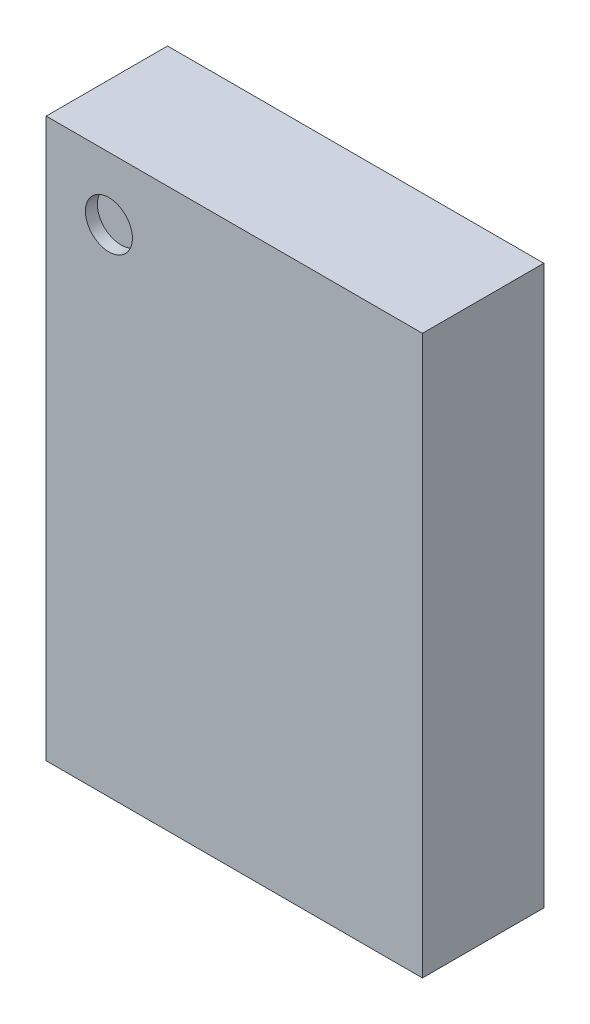
ISO-10303-21;
HEADER;
FILE_DESCRIPTION(('STEP AP214'),'2;1');
FILE_NAME('part.step','',(''),(''),'','','');
FILE_SCHEMA(('AUTOMOTIVE_DESIGN { 1 0 10303 214 1 1 1 1 }'));
ENDSEC;
DATA;
#1=APPLICATION_CONTEXT('core data for automotive mechanical design processes');
#2=APPLICATION_PROTOCOL_DEFINITION('international standard','automotive_design',2000,#1);
#3=PRODUCT_CONTEXT('',#1,'mechanical');
#4=PRODUCT('Part','Part','',(#3));
#5=PRODUCT_RELATED_PRODUCT_CATEGORY('part','',(#4));
#6=PRODUCT_DEFINITION_FORMATION('','',#4);
#7=PRODUCT_DEFINITION_CONTEXT('part definition',#1,'design');
#8=PRODUCT_DEFINITION('design','',#6,#7);
#9=PRODUCT_DEFINITION_SHAPE('','',#8);
#10=(LENGTH_UNIT() NAMED_UNIT(*) SI_UNIT(.MILLI.,.METRE.));
#11=(NAMED_UNIT(*) PLANE_ANGLE_UNIT() SI_UNIT($,.RADIAN.));
#12=(NAMED_UNIT(*) SI_UNIT($,.STERADIAN.) SOLID_ANGLE_UNIT());
#13=UNCERTAINTY_MEASURE_WITH_UNIT(LENGTH_MEASURE(1.E-05),#10,'distance_accuracy_value','');
#14=(GEOMETRIC_REPRESENTATION_CONTEXT(3) GLOBAL_UNCERTAINTY_ASSIGNED_CONTEXT((#13)) GLOBAL_UNIT_ASSIGNED_CONTEXT((#10,
#11,#12)) REPRESENTATION_CONTEXT('',''));
#15=CARTESIAN_POINT('',(0.,0.,0.));
#16=DIRECTION('',(0.,0.,1.));
#17=DIRECTION('',(1.,0.,0.));
#18=AXIS2_PLACEMENT_3D('',#15,#16,#17);
#19=CARTESIAN_POINT('',(-0.83958364514089,1.78333318653556,0.901));
#20=DIRECTION('',(0.,0.,-1.));
#21=DIRECTION('',(-0.999999999999985,-1.74845553146949E-07,0.));
#22=AXIS2_PLACEMENT_3D('',#19,#20,#21);
#23=PLANE('',#22);
#24=CARTESIAN_POINT('',(-1.03333364514089,1.78333315265924,0.901));
#25=DIRECTION('',(0.,0.,1.));
#26=DIRECTION('',(0.999999999999985,1.74845553146949E-07,0.));
#27=AXIS2_PLACEMENT_3D('',#24,#25,#26);
#28=CIRCLE('',#27,0.19375);
#29=CARTESIAN_POINT('',(-0.83958364514089,1.78333318653556,0.901));
#30=VERTEX_POINT('',#29);
#31=EDGE_CURVE('P0_E11',#30,#30,#28,.T.);
#32=ORIENTED_EDGE('',*,*,#31,.F.);
#33=EDGE_LOOP('',(#32));
#34=FACE_BOUND('',#33,.T.);
#35=ADVANCED_FACE('P0_F16',(#34),#23,.T.);
#36=OPEN_SHELL('',(#35));
#37=SHELL_BASED_SURFACE_MODEL('P0_B1',(#36));
#38=CARTESIAN_POINT('',(-1.5499995978552,-2.30000027101057,0.));
#39=DIRECTION('',(0.999999999999985,1.74845553146949E-07,0.));
#40=DIRECTION('',(0.,0.,1.));
#41=AXIS2_PLACEMENT_3D('',#38,#39,#40);
#42=PLANE('',#41);
#43=DIRECTION('',(-1.74845553146949E-07,0.999999999999985,0.));
#44=VECTOR('',#43,1.);
#45=CARTESIAN_POINT('',(-1.5499995978552,-2.30000027101057,1.));
#46=LINE('',#45,#44);
#47=CARTESIAN_POINT('',(-1.5499995978552,-2.30000027101057,1.));
#48=VERTEX_POINT('',#47);
#49=CARTESIAN_POINT('',(-1.55000040214475,2.29999972898936,1.));
#50=VERTEX_POINT('',#49);
#51=EDGE_CURVE('P1_E11',#48,#50,#46,.T.);
#52=ORIENTED_EDGE('',*,*,#51,.T.);
#53=DIRECTION('',(0.,0.,1.));
#54=VECTOR('',#53,1.);
#55=CARTESIAN_POINT('',(-1.55000040214475,2.29999972898936,0.));
#56=LINE('',#55,#54);
#57=CARTESIAN_POINT('',(-1.55000040214475,2.29999972898936,0.));
#58=VERTEX_POINT('',#57);
#59=EDGE_CURVE('P1_E23',#58,#50,#56,.T.);
#60=ORIENTED_EDGE('',*,*,#59,.F.);
#61=DIRECTION('',(-1.74845553146949E-07,0.999999999999985,0.));
#62=VECTOR('',#61,1.);
#63=CARTESIAN_POINT('',(-1.5499995978552,-2.30000027101057,0.));
#64=LINE('',#63,#62);
#65=CARTESIAN_POINT('',(-1.5499995978552,-2.30000027101057,0.));
#66=VERTEX_POINT('',#65);
#67=EDGE_CURVE('P1_E96',#66,#58,#64,.T.);
#68=ORIENTED_EDGE('',*,*,#67,.F.);
#69=DIRECTION('',(0.,0.,1.));
#70=VECTOR('',#69,1.);
#71=CARTESIAN_POINT('',(-1.5499995978552,-2.30000027101057,0.));
#72=LINE('',#71,#70);
#73=EDGE_CURVE('P1_E35',#66,#48,#72,.T.);
#74=ORIENTED_EDGE('',*,*,#73,.T.);
#75=EDGE_LOOP('',(#52,#60,#68,#74));
#76=FACE_BOUND('',#75,.T.);
#77=ADVANCED_FACE('P1_F16',(#76),#42,.F.);
#78=CARTESIAN_POINT('',(-1.5499995978552,-2.30000027101057,0.));
#79=DIRECTION('',(-1.74845553146949E-07,0.999999999999985,0.));
#80=DIRECTION('',(0.,0.,1.));
#81=AXIS2_PLACEMENT_3D('',#78,#79,#80);
#82=PLANE('',#81);
#83=DIRECTION('',(0.,0.,1.));
#84=VECTOR('',#83,1.);
#85=CARTESIAN_POINT('',(1.55000040214475,-2.29999972898936,0.));
#86=LINE('',#85,#84);
#87=CARTESIAN_POINT('',(1.55000040214475,-2.29999972898936,0.));
#88=VERTEX_POINT('',#87);
#89=CARTESIAN_POINT('',(1.55000040214475,-2.29999972898936,1.));
#90=VERTEX_POINT('',#89);
#91=EDGE_CURVE('P1_E92',#88,#90,#86,.T.);
#92=ORIENTED_EDGE('',*,*,#91,.T.);
#93=DIRECTION('',(0.999999999999985,1.74845553146949E-07,0.));
#94=VECTOR('',#93,1.);
#95=CARTESIAN_POINT('',(-1.5499995978552,-2.30000027101057,1.));
#96=LINE('',#95,#94);
#97=EDGE_CURVE('P1_E89',#48,#90,#96,.T.);
#98=ORIENTED_EDGE('',*,*,#97,.F.);
#99=ORIENTED_EDGE('',*,*,#73,.F.);
#100=DIRECTION('',(0.999999999999985,1.74845553146949E-07,0.));
#101=VECTOR('',#100,1.);
#102=CARTESIAN_POINT('',(-1.5499995978552,-2.30000027101057,0.));
#103=LINE('',#102,#101);
#104=EDGE_CURVE('P1_E87',#66,#88,#103,.T.);
#105=ORIENTED_EDGE('',*,*,#104,.T.);
#106=EDGE_LOOP('',(#92,#98,#99,#105));
#107=FACE_BOUND('',#106,.T.);
#108=ADVANCED_FACE('P1_F108',(#107),#82,.F.);
#109=CARTESIAN_POINT('',(-1.5499995978552,-2.30000027101057,1.));
#110=DIRECTION('',(0.,0.,1.));
#111=DIRECTION('',(0.999999999999985,1.74845553146949E-07,0.));
#112=AXIS2_PLACEMENT_3D('',#109,#110,#111);
#113=PLANE('',#112);
#114=ORIENTED_EDGE('',*,*,#51,.F.);
#115=ORIENTED_EDGE('',*,*,#97,.T.);
#116=DIRECTION('',(-1.74845553146949E-07,0.999999999999985,0.));
#117=VECTOR('',#116,1.);
#118=CARTESIAN_POINT('',(1.55000040214475,-2.29999972898936,1.));
#119=LINE('',#118,#117);
#120=CARTESIAN_POINT('',(1.5499995978552,2.30000027101057,1.));
#121=VERTEX_POINT('',#120);
#122=EDGE_CURVE('P1_E85',#90,#121,#119,.T.);
#123=ORIENTED_EDGE('',*,*,#122,.T.);
#124=DIRECTION('',(0.999999999999985,1.74845553146949E-07,0.));
#125=VECTOR('',#124,1.);
#126=CARTESIAN_POINT('',(-1.55000040214475,2.29999972898936,1.));
#127=LINE('',#126,#125);
#128=EDGE_CURVE('P1_E83',#50,#121,#127,.T.);
#129=ORIENTED_EDGE('',*,*,#128,.F.);
#130=EDGE_LOOP('',(#114,#115,#123,#129));
#131=FACE_BOUND('',#130,.T.);
#132=CARTESIAN_POINT('',(-1.03333364514089,1.78333315265924,1.));
#133=DIRECTION('',(0.,0.,1.));
#134=DIRECTION('',(0.999999999999985,1.74845553146949E-07,0.));
#135=AXIS2_PLACEMENT_3D('',#132,#133,#134);
#136=CIRCLE('',#135,0.19375);
#137=CARTESIAN_POINT('',(-0.83958364514089,1.78333318653556,1.));
#138=VERTEX_POINT('',#137);
#139=EDGE_CURVE('P1_E67',#138,#138,#136,.T.);
#140=ORIENTED_EDGE('',*,*,#139,.F.);
#141=EDGE_LOOP('',(#140));
#142=FACE_BOUND('',#141,.T.);
#143=ADVANCED_FACE('P1_F110',(#131,#142),#113,.T.);
#144=CARTESIAN_POINT('',(-1.55000040214475,2.29999972898936,0.));
#145=DIRECTION('',(-1.74845553146949E-07,0.999999999999985,0.));
#146=DIRECTION('',(0.,0.,1.));
#147=AXIS2_PLACEMENT_3D('',#144,#145,#146);
#148=PLANE('',#147);
#149=DIRECTION('',(0.999999999999985,1.74845553146949E-07,0.));
#150=VECTOR('',#149,1.);
#151=CARTESIAN_POINT('',(-1.55000040214475,2.29999972898936,0.));
#152=LINE('',#151,#150);
#153=CARTESIAN_POINT('',(1.5499995978552,2.30000027101057,0.));
#154=VERTEX_POINT('',#153);
#155=EDGE_CURVE('P1_E79',#58,#154,#152,.T.);
#156=ORIENTED_EDGE('',*,*,#155,.F.);
#157=ORIENTED_EDGE('',*,*,#59,.T.);
#158=ORIENTED_EDGE('',*,*,#128,.T.);
#159=DIRECTION('',(0.,0.,1.));
#160=VECTOR('',#159,1.);
#161=CARTESIAN_POINT('',(1.5499995978552,2.30000027101057,0.));
#162=LINE('',#161,#160);
#163=EDGE_CURVE('P1_E74',#154,#121,#162,.T.);
#164=ORIENTED_EDGE('',*,*,#163,.F.);
#165=EDGE_LOOP('',(#156,#157,#158,#164));
#166=FACE_BOUND('',#165,.T.);
#167=ADVANCED_FACE('P1_F102',(#166),#148,.T.);
#168=CARTESIAN_POINT('',(-1.5499995978552,-2.30000027101057,0.));
#169=DIRECTION('',(0.,0.,1.));
#170=DIRECTION('',(0.999999999999985,1.74845553146949E-07,0.));
#171=AXIS2_PLACEMENT_3D('',#168,#169,#170);
#172=PLANE('',#171);
#173=ORIENTED_EDGE('',*,*,#155,.T.);
#174=DIRECTION('',(-1.74845553146949E-07,0.999999999999985,0.));
#175=VECTOR('',#174,1.);
#176=CARTESIAN_POINT('',(1.55000040214475,-2.29999972898936,0.));
#177=LINE('',#176,#175);
#178=EDGE_CURVE('P1_E71',#88,#154,#177,.T.);
#179=ORIENTED_EDGE('',*,*,#178,.F.);
#180=ORIENTED_EDGE('',*,*,#104,.F.);
#181=ORIENTED_EDGE('',*,*,#67,.T.);
#182=EDGE_LOOP('',(#173,#179,#180,#181));
#183=FACE_BOUND('',#182,.T.);
#184=ADVANCED_FACE('P1_F99',(#183),#172,.F.);
#185=CARTESIAN_POINT('',(1.55000040214475,-2.29999972898936,0.));
#186=DIRECTION('',(0.999999999999985,1.74845553146949E-07,0.));
#187=DIRECTION('',(0.,0.,1.));
#188=AXIS2_PLACEMENT_3D('',#185,#186,#187);
#189=PLANE('',#188);
#190=ORIENTED_EDGE('',*,*,#91,.F.);
#191=ORIENTED_EDGE('',*,*,#178,.T.);
#192=ORIENTED_EDGE('',*,*,#163,.T.);
#193=ORIENTED_EDGE('',*,*,#122,.F.);
#194=EDGE_LOOP('',(#190,#191,#192,#193));
#195=FACE_BOUND('',#194,.T.);
#196=ADVANCED_FACE('P1_F105',(#195),#189,.T.);
#197=CARTESIAN_POINT('',(-1.03333364514089,1.78333315265924,0.9));
#198=DIRECTION('',(0.,0.,1.));
#199=DIRECTION('',(0.999999999999985,1.74845553146949E-07,0.));
#200=AXIS2_PLACEMENT_3D('',#197,#198,#199);
#201=CYLINDRICAL_SURFACE('',#200,0.19375);
#202=CARTESIAN_POINT('',(-1.03333364514089,1.78333315265924,0.9));
#203=DIRECTION('',(0.,0.,1.));
#204=DIRECTION('',(0.999999999999985,1.74845553146949E-07,0.));
#205=AXIS2_PLACEMENT_3D('',#202,#203,#204);
#206=CIRCLE('',#205,0.19375);
#207=CARTESIAN_POINT('',(-0.83958364514089,1.78333318653556,0.9));
#208=VERTEX_POINT('',#207);
#209=EDGE_CURVE('P1_E65',#208,#208,#206,.T.);
#210=ORIENTED_EDGE('',*,*,#209,.F.);
#211=DIRECTION('',(0.,0.,1.));
#212=VECTOR('',#211,1.);
#213=CARTESIAN_POINT('',(-0.83958364514089,1.78333318653556,0.9));
#214=LINE('',#213,#212);
#215=EDGE_CURVE('P1_E62',#208,#138,#214,.T.);
#216=ORIENTED_EDGE('',*,*,#215,.T.);
#217=ORIENTED_EDGE('',*,*,#139,.T.);
#218=ORIENTED_EDGE('',*,*,#215,.F.);
#219=EDGE_LOOP('',(#210,#216,#217,#218));
#220=FACE_BOUND('',#219,.T.);
#221=ADVANCED_FACE('P1_F64',(#220),#201,.F.);
#222=CARTESIAN_POINT('',(-1.03333364514089,1.78333315265924,0.9));
#223=DIRECTION('',(0.,0.,1.));
#224=DIRECTION('',(0.999999999999985,1.74845553146949E-07,0.));
#225=AXIS2_PLACEMENT_3D('',#222,#223,#224);
#226=PLANE('',#225);
#227=ORIENTED_EDGE('',*,*,#209,.T.);
#228=EDGE_LOOP('',(#227));
#229=FACE_BOUND('',#228,.T.);
#230=ADVANCED_FACE('P1_F70',(#229),#226,.T.);
#231=CLOSED_SHELL('',(#77,#108,#143,#167,#184,#196,#221,#230));
#232=MANIFOLD_SOLID_BREP('P1_B1',#231);
#233=CARTESIAN_POINT('',(-0.799999632824326,-2.10000013987641,-0.001));
#234=DIRECTION('',(-1.74845553146949E-07,0.999999999999985,0.));
#235=DIRECTION('',(0.999999999999985,1.74845553146949E-07,0.));
#236=AXIS2_PLACEMENT_3D('',#233,#234,#235);
#237=PLANE('',#236);
#238=DIRECTION('',(0.999999999999985,1.74845553146949E-07,0.));
#239=VECTOR('',#238,1.);
#240=CARTESIAN_POINT('',(-0.799999632824326,-2.10000013987641,-0.001));
#241=LINE('',#240,#239);
#242=CARTESIAN_POINT('',(-0.799999632824326,-2.10000013987641,-0.001));
#243=VERTEX_POINT('',#242);
#244=CARTESIAN_POINT('',(0.800000367175649,-2.09999986012353,-0.001));
#245=VERTEX_POINT('',#244);
#246=EDGE_CURVE('P2_E11',#243,#245,#241,.T.);
#247=ORIENTED_EDGE('',*,*,#246,.T.);
#248=DIRECTION('',(0.,0.,1.));
#249=VECTOR('',#248,1.);
#250=CARTESIAN_POINT('',(0.800000367175649,-2.09999986012353,-0.001));
#251=LINE('',#250,#249);
#252=CARTESIAN_POINT('',(0.800000367175649,-2.09999986012353,0.));
#253=VERTEX_POINT('',#252);
#254=EDGE_CURVE('P2_E23',#245,#253,#251,.T.);
#255=ORIENTED_EDGE('',*,*,#254,.T.);
#256=DIRECTION('',(0.999999999999985,1.74845553146949E-07,0.));
#257=VECTOR('',#256,1.);
#258=CARTESIAN_POINT('',(-0.799999632824326,-2.10000013987641,0.));
#259=LINE('',#258,#257);
#260=CARTESIAN_POINT('',(-0.799999632824326,-2.10000013987641,0.));
#261=VERTEX_POINT('',#260);
#262=EDGE_CURVE('P2_E101',#261,#253,#259,.T.);
#263=ORIENTED_EDGE('',*,*,#262,.F.);
#264=DIRECTION('',(0.,0.,1.));
#265=VECTOR('',#264,1.);
#266=CARTESIAN_POINT('',(-0.799999632824326,-2.10000013987641,-0.001));
#267=LINE('',#266,#265);
#268=EDGE_CURVE('P2_E35',#243,#261,#267,.T.);
#269=ORIENTED_EDGE('',*,*,#268,.F.);
#270=EDGE_LOOP('',(#247,#255,#263,#269));
#271=FACE_BOUND('',#270,.T.);
#272=ADVANCED_FACE('P2_F16',(#271),#237,.F.);
#273=CARTESIAN_POINT('',(0.800000367175649,-2.09999986012353,-0.001));
#274=DIRECTION('',(-0.999999999999985,-1.74845553146949E-07,0.));
#275=DIRECTION('',(-1.74845553146949E-07,0.999999999999985,0.));
#276=AXIS2_PLACEMENT_3D('',#273,#274,#275);
#277=PLANE('',#276);
#278=DIRECTION('',(-1.74845553146949E-07,0.999999999999985,0.));
#279=VECTOR('',#278,1.);
#280=CARTESIAN_POINT('',(0.800000367175649,-2.09999986012353,-0.001));
#281=LINE('',#280,#279);
#282=CARTESIAN_POINT('',(0.799999632824326,2.10000013987641,-0.001));
#283=VERTEX_POINT('',#282);
#284=EDGE_CURVE('P2_E98',#245,#283,#281,.T.);
#285=ORIENTED_EDGE('',*,*,#284,.T.);
#286=DIRECTION('',(0.,0.,1.));
#287=VECTOR('',#286,1.);
#288=CARTESIAN_POINT('',(0.799999632824326,2.10000013987641,-0.001));
#289=LINE('',#288,#287);
#290=CARTESIAN_POINT('',(0.799999632824326,2.10000013987641,0.));
#291=VERTEX_POINT('',#290);
#292=EDGE_CURVE('P2_E95',#283,#291,#289,.T.);
#293=ORIENTED_EDGE('',*,*,#292,.T.);
#294=DIRECTION('',(-1.74845553146949E-07,0.999999999999985,0.));
#295=VECTOR('',#294,1.);
#296=CARTESIAN_POINT('',(0.800000367175649,-2.09999986012353,0.));
#297=LINE('',#296,#295);
#298=EDGE_CURVE('P2_E93',#253,#291,#297,.T.);
#299=ORIENTED_EDGE('',*,*,#298,.F.);
#300=ORIENTED_EDGE('',*,*,#254,.F.);
#301=EDGE_LOOP('',(#285,#293,#299,#300));
#302=FACE_BOUND('',#301,.T.);
#303=ADVANCED_FACE('P2_F103',(#302),#277,.F.);
#304=CARTESIAN_POINT('',(0.799999632824326,2.10000013987641,-0.001));
#305=DIRECTION('',(1.74845553146949E-07,-0.999999999999985,0.));
#306=DIRECTION('',(-0.999999999999985,-1.74845553146949E-07,0.));
#307=AXIS2_PLACEMENT_3D('',#304,#305,#306);
#308=PLANE('',#307);
#309=DIRECTION('',(-0.999999999999985,-1.74845553146949E-07,0.));
#310=VECTOR('',#309,1.);
#311=CARTESIAN_POINT('',(0.799999632824326,2.10000013987641,-0.001));
#312=LINE('',#311,#310);
#313=CARTESIAN_POINT('',(-0.450000367175655,2.09999992131947,-0.001));
#314=VERTEX_POINT('',#313);
#315=EDGE_CURVE('P2_E90',#283,#314,#312,.T.);
#316=ORIENTED_EDGE('',*,*,#315,.T.);
#317=DIRECTION('',(0.,0.,1.));
#318=VECTOR('',#317,1.);
#319=CARTESIAN_POINT('',(-0.450000367175655,2.09999992131947,-0.001));
#320=LINE('',#319,#318);
#321=CARTESIAN_POINT('',(-0.450000367175655,2.09999992131947,0.));
#322=VERTEX_POINT('',#321);
#323=EDGE_CURVE('P2_E88',#314,#322,#320,.T.);
#324=ORIENTED_EDGE('',*,*,#323,.T.);
#325=DIRECTION('',(-0.999999999999985,-1.74845553146949E-07,0.));
#326=VECTOR('',#325,1.);
#327=CARTESIAN_POINT('',(0.799999632824326,2.10000013987641,0.));
#328=LINE('',#327,#326);
#329=EDGE_CURVE('P2_E82',#291,#322,#328,.T.);
#330=ORIENTED_EDGE('',*,*,#329,.F.);
#331=ORIENTED_EDGE('',*,*,#292,.F.);
#332=EDGE_LOOP('',(#316,#324,#330,#331));
#333=FACE_BOUND('',#332,.T.);
#334=ADVANCED_FACE('P2_F106',(#333),#308,.F.);
#335=CARTESIAN_POINT('',(-0.450000367175655,2.09999992131947,-0.001));
#336=DIRECTION('',(0.707106904821013,-0.70710665755206,0.));
#337=DIRECTION('',(-0.70710665755206,-0.707106904821013,0.));
#338=AXIS2_PLACEMENT_3D('',#335,#336,#337);
#339=PLANE('',#338);
#340=DIRECTION('',(-0.70710665755206,-0.707106904821013,0.));
#341=VECTOR('',#340,1.);
#342=CARTESIAN_POINT('',(-0.450000367175655,2.09999992131947,-0.001));
#343=LINE('',#342,#341);
#344=CARTESIAN_POINT('',(-0.800000305979706,1.74999986012353,-0.001));
#345=VERTEX_POINT('',#344);
#346=EDGE_CURVE('P2_E69',#314,#345,#343,.T.);
#347=ORIENTED_EDGE('',*,*,#346,.T.);
#348=DIRECTION('',(0.,0.,1.));
#349=VECTOR('',#348,1.);
#350=CARTESIAN_POINT('',(-0.800000305979706,1.74999986012353,-0.001));
#351=LINE('',#350,#349);
#352=CARTESIAN_POINT('',(-0.800000305979706,1.74999986012353,0.));
#353=VERTEX_POINT('',#352);
#354=EDGE_CURVE('P2_E62',#345,#353,#351,.T.);
#355=ORIENTED_EDGE('',*,*,#354,.T.);
#356=DIRECTION('',(-0.70710665755206,-0.707106904821013,0.));
#357=VECTOR('',#356,1.);
#358=CARTESIAN_POINT('',(-0.450000367175655,2.09999992131947,0.));
#359=LINE('',#358,#357);
#360=EDGE_CURVE('P2_E67',#322,#353,#359,.T.);
#361=ORIENTED_EDGE('',*,*,#360,.F.);
#362=ORIENTED_EDGE('',*,*,#323,.F.);
#363=EDGE_LOOP('',(#347,#355,#361,#362));
#364=FACE_BOUND('',#363,.T.);
#365=ADVANCED_FACE('P2_F64',(#364),#339,.F.);
#366=CARTESIAN_POINT('',(-0.800000305979706,1.74999986012353,-0.001));
#367=DIRECTION('',(0.999999999999985,1.74845553146949E-07,0.));
#368=DIRECTION('',(1.74845553146949E-07,-0.999999999999985,0.));
#369=AXIS2_PLACEMENT_3D('',#366,#367,#368);
#370=PLANE('',#369);
#371=DIRECTION('',(1.74845553146949E-07,-0.999999999999985,0.));
#372=VECTOR('',#371,1.);
#373=CARTESIAN_POINT('',(-0.800000305979706,1.74999986012353,-0.001));
#374=LINE('',#373,#372);
#375=EDGE_CURVE('P2_E78',#345,#243,#374,.T.);
#376=ORIENTED_EDGE('',*,*,#375,.T.);
#377=ORIENTED_EDGE('',*,*,#268,.T.);
#378=DIRECTION('',(1.74845553146949E-07,-0.999999999999985,0.));
#379=VECTOR('',#378,1.);
#380=CARTESIAN_POINT('',(-0.800000305979706,1.74999986012353,0.));
#381=LINE('',#380,#379);
#382=EDGE_CURVE('P2_E75',#353,#261,#381,.T.);
#383=ORIENTED_EDGE('',*,*,#382,.F.);
#384=ORIENTED_EDGE('',*,*,#354,.F.);
#385=EDGE_LOOP('',(#376,#377,#383,#384));
#386=FACE_BOUND('',#385,.T.);
#387=ADVANCED_FACE('P2_F76',(#386),#370,.F.);
#388=CARTESIAN_POINT('',(-0.799999632824326,-2.10000013987641,-0.001));
#389=DIRECTION('',(0.,0.,-1.));
#390=DIRECTION('',(-0.999999999999985,-1.74845553146949E-07,0.));
#391=AXIS2_PLACEMENT_3D('',#388,#389,#390);
#392=PLANE('',#391);
#393=ORIENTED_EDGE('',*,*,#375,.F.);
#394=ORIENTED_EDGE('',*,*,#346,.F.);
#395=ORIENTED_EDGE('',*,*,#315,.F.);
#396=ORIENTED_EDGE('',*,*,#284,.F.);
#397=ORIENTED_EDGE('',*,*,#246,.F.);
#398=EDGE_LOOP('',(#393,#394,#395,#396,#397));
#399=FACE_BOUND('',#398,.T.);
#400=ADVANCED_FACE('P2_F108',(#399),#392,.T.);
#401=CARTESIAN_POINT('',(-0.799999632824326,-2.10000013987641,0.));
#402=DIRECTION('',(0.,0.,-1.));
#403=DIRECTION('',(-0.999999999999985,-1.74845553146949E-07,0.));
#404=AXIS2_PLACEMENT_3D('',#401,#402,#403);
#405=PLANE('',#404);
#406=ORIENTED_EDGE('',*,*,#262,.T.);
#407=ORIENTED_EDGE('',*,*,#298,.T.);
#408=ORIENTED_EDGE('',*,*,#329,.T.);
#409=ORIENTED_EDGE('',*,*,#360,.T.);
#410=ORIENTED_EDGE('',*,*,#382,.T.);
#411=EDGE_LOOP('',(#406,#407,#408,#409,#410));
#412=FACE_BOUND('',#411,.T.);
#413=ADVANCED_FACE('P2_F80',(#412),#405,.F.);
#414=CLOSED_SHELL('',(#272,#303,#334,#365,#387,#400,#413));
#415=MANIFOLD_SOLID_BREP('P2_B1',#414);
#416=ADVANCED_BREP_SHAPE_REPRESENTATION('',(#18,#232,#415),#14);
#417=MANIFOLD_SURFACE_SHAPE_REPRESENTATION('',(#18,#37),#14);
#418=SHAPE_REPRESENTATION('',(#18),#14);
#419=SHAPE_DEFINITION_REPRESENTATION(#9,#418);
#420=SHAPE_REPRESENTATION_RELATIONSHIP('','',#418,#416);
#421=SHAPE_REPRESENTATION_RELATIONSHIP('','',#418,#417);
ENDSEC;
END-ISO-10303-21;
